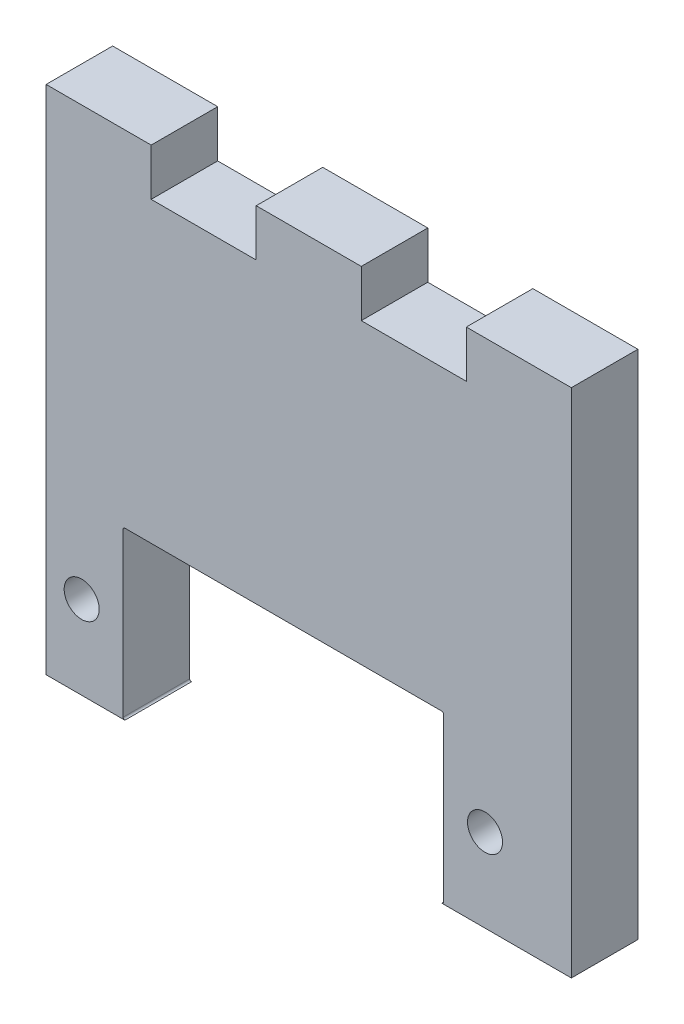
ISO-10303-21;
HEADER;
FILE_DESCRIPTION(('STEP AP214'),'2;1');
FILE_NAME('part.step','',(''),(''),'','','');
FILE_SCHEMA(('AUTOMOTIVE_DESIGN { 1 0 10303 214 1 1 1 1 }'));
ENDSEC;
DATA;
#1=APPLICATION_CONTEXT('core data for automotive mechanical design processes');
#2=APPLICATION_PROTOCOL_DEFINITION('international standard','automotive_design',2000,#1);
#3=PRODUCT_CONTEXT('',#1,'mechanical');
#4=PRODUCT('Part','Part','',(#3));
#5=PRODUCT_RELATED_PRODUCT_CATEGORY('part','',(#4));
#6=PRODUCT_DEFINITION_FORMATION('','',#4);
#7=PRODUCT_DEFINITION_CONTEXT('part definition',#1,'design');
#8=PRODUCT_DEFINITION('design','',#6,#7);
#9=PRODUCT_DEFINITION_SHAPE('','',#8);
#10=(LENGTH_UNIT() NAMED_UNIT(*) SI_UNIT(.MILLI.,.METRE.));
#11=(NAMED_UNIT(*) PLANE_ANGLE_UNIT() SI_UNIT($,.RADIAN.));
#12=(NAMED_UNIT(*) SI_UNIT($,.STERADIAN.) SOLID_ANGLE_UNIT());
#13=UNCERTAINTY_MEASURE_WITH_UNIT(LENGTH_MEASURE(1.E-05),#10,'distance_accuracy_value','');
#14=(GEOMETRIC_REPRESENTATION_CONTEXT(3) GLOBAL_UNCERTAINTY_ASSIGNED_CONTEXT((#13)) GLOBAL_UNIT_ASSIGNED_CONTEXT((#10,
#11,#12)) REPRESENTATION_CONTEXT('',''));
#15=CARTESIAN_POINT('',(0.,0.,0.));
#16=DIRECTION('',(0.,0.,1.));
#17=DIRECTION('',(1.,0.,0.));
#18=AXIS2_PLACEMENT_3D('',#15,#16,#17);
#19=CARTESIAN_POINT('',(0.,37.084,4.826));
#20=DIRECTION('',(0.,-1.,0.));
#21=DIRECTION('',(0.,0.,-1.));
#22=AXIS2_PLACEMENT_3D('',#19,#20,#21);
#23=PLANE('',#22);
#24=DIRECTION('',(-1.,0.,0.));
#25=VECTOR('',#24,1.);
#26=CARTESIAN_POINT('',(0.,37.084,4.826));
#27=LINE('',#26,#25);
#28=CARTESIAN_POINT('',(22.86,37.084,4.826));
#29=VERTEX_POINT('',#28);
#30=CARTESIAN_POINT('',(15.24,37.084,4.826));
#31=VERTEX_POINT('',#30);
#32=EDGE_CURVE('E316',#29,#31,#27,.T.);
#33=ORIENTED_EDGE('',*,*,#32,.F.);
#34=DIRECTION('',(0.,0.,1.));
#35=VECTOR('',#34,1.);
#36=CARTESIAN_POINT('',(22.86,37.084,0.));
#37=LINE('',#36,#35);
#38=CARTESIAN_POINT('',(22.86,37.084,0.));
#39=VERTEX_POINT('',#38);
#40=EDGE_CURVE('E199',#39,#29,#37,.T.);
#41=ORIENTED_EDGE('',*,*,#40,.F.);
#42=DIRECTION('',(-1.,0.,0.));
#43=VECTOR('',#42,1.);
#44=CARTESIAN_POINT('',(0.,37.084,0.));
#45=LINE('',#44,#43);
#46=CARTESIAN_POINT('',(15.24,37.084,0.));
#47=VERTEX_POINT('',#46);
#48=EDGE_CURVE('E190',#39,#47,#45,.T.);
#49=ORIENTED_EDGE('',*,*,#48,.T.);
#50=DIRECTION('',(0.,0.,1.));
#51=VECTOR('',#50,1.);
#52=CARTESIAN_POINT('',(15.24,37.084,0.));
#53=LINE('',#52,#51);
#54=EDGE_CURVE('E225',#47,#31,#53,.T.);
#55=ORIENTED_EDGE('',*,*,#54,.T.);
#56=EDGE_LOOP('',(#33,#41,#49,#55));
#57=FACE_BOUND('',#56,.T.);
#58=ADVANCED_FACE('F32',(#57),#23,.F.);
#59=CARTESIAN_POINT('',(7.61999999999999,37.084,4.826));
#60=VERTEX_POINT('',#59);
#61=CARTESIAN_POINT('',(0.,37.084,4.826));
#62=VERTEX_POINT('',#61);
#63=EDGE_CURVE('E311',#60,#62,#27,.T.);
#64=ORIENTED_EDGE('',*,*,#63,.F.);
#65=DIRECTION('',(0.,0.,1.));
#66=VECTOR('',#65,1.);
#67=CARTESIAN_POINT('',(7.61999999999999,37.084,0.));
#68=LINE('',#67,#66);
#69=CARTESIAN_POINT('',(7.61999999999999,37.084,0.));
#70=VERTEX_POINT('',#69);
#71=EDGE_CURVE('E222',#70,#60,#68,.T.);
#72=ORIENTED_EDGE('',*,*,#71,.F.);
#73=CARTESIAN_POINT('',(0.,37.084,0.));
#74=VERTEX_POINT('',#73);
#75=EDGE_CURVE('E325',#70,#74,#45,.T.);
#76=ORIENTED_EDGE('',*,*,#75,.T.);
#77=DIRECTION('',(0.,0.,-1.));
#78=VECTOR('',#77,1.);
#79=CARTESIAN_POINT('',(0.,37.084,4.826));
#80=LINE('',#79,#78);
#81=EDGE_CURVE('E315',#62,#74,#80,.T.);
#82=ORIENTED_EDGE('',*,*,#81,.F.);
#83=EDGE_LOOP('',(#64,#72,#76,#82));
#84=FACE_BOUND('',#83,.T.);
#85=ADVANCED_FACE('F399',(#84),#23,.F.);
#86=CARTESIAN_POINT('',(0.,0.,4.826));
#87=DIRECTION('',(0.,1.,0.));
#88=DIRECTION('',(0.,0.,1.));
#89=AXIS2_PLACEMENT_3D('',#86,#87,#88);
#90=PLANE('',#89);
#91=DIRECTION('',(0.,0.,-1.));
#92=VECTOR('',#91,1.);
#93=CARTESIAN_POINT('',(5.71500000000001,0.,4.826));
#94=LINE('',#93,#92);
#95=CARTESIAN_POINT('',(5.71500000000001,0.,4.826));
#96=VERTEX_POINT('',#95);
#97=CARTESIAN_POINT('',(5.71500000000001,0.,0.));
#98=VERTEX_POINT('',#97);
#99=EDGE_CURVE('E280',#96,#98,#94,.T.);
#100=ORIENTED_EDGE('',*,*,#99,.F.);
#101=DIRECTION('',(1.,0.,0.));
#102=VECTOR('',#101,1.);
#103=CARTESIAN_POINT('',(0.,0.,4.826));
#104=LINE('',#103,#102);
#105=CARTESIAN_POINT('',(0.,0.,4.826));
#106=VERTEX_POINT('',#105);
#107=EDGE_CURVE('E306',#106,#96,#104,.T.);
#108=ORIENTED_EDGE('',*,*,#107,.F.);
#109=DIRECTION('',(0.,0.,-1.));
#110=VECTOR('',#109,1.);
#111=CARTESIAN_POINT('',(0.,0.,4.826));
#112=LINE('',#111,#110);
#113=CARTESIAN_POINT('',(0.,0.,0.));
#114=VERTEX_POINT('',#113);
#115=EDGE_CURVE('E11',#106,#114,#112,.T.);
#116=ORIENTED_EDGE('',*,*,#115,.T.);
#117=DIRECTION('',(1.,0.,0.));
#118=VECTOR('',#117,1.);
#119=CARTESIAN_POINT('',(0.,0.,0.));
#120=LINE('',#119,#118);
#121=EDGE_CURVE('E320',#114,#98,#120,.T.);
#122=ORIENTED_EDGE('',*,*,#121,.T.);
#123=EDGE_LOOP('',(#100,#108,#116,#122));
#124=FACE_BOUND('',#123,.T.);
#125=ADVANCED_FACE('F381',(#124),#90,.F.);
#126=CARTESIAN_POINT('',(0.,0.,4.826));
#127=DIRECTION('',(1.,0.,0.));
#128=DIRECTION('',(0.,1.,0.));
#129=AXIS2_PLACEMENT_3D('',#126,#127,#128);
#130=PLANE('',#129);
#131=DIRECTION('',(0.,-1.,0.));
#132=VECTOR('',#131,1.);
#133=CARTESIAN_POINT('',(0.,0.,0.));
#134=LINE('',#133,#132);
#135=EDGE_CURVE('E298',#74,#114,#134,.T.);
#136=ORIENTED_EDGE('',*,*,#135,.T.);
#137=ORIENTED_EDGE('',*,*,#115,.F.);
#138=DIRECTION('',(0.,-1.,0.));
#139=VECTOR('',#138,1.);
#140=CARTESIAN_POINT('',(0.,0.,4.826));
#141=LINE('',#140,#139);
#142=EDGE_CURVE('E301',#62,#106,#141,.T.);
#143=ORIENTED_EDGE('',*,*,#142,.F.);
#144=ORIENTED_EDGE('',*,*,#81,.T.);
#145=EDGE_LOOP('',(#136,#137,#143,#144));
#146=FACE_BOUND('',#145,.T.);
#147=ADVANCED_FACE('F34',(#146),#130,.F.);
#148=CARTESIAN_POINT('',(28.702,0.,4.826));
#149=VERTEX_POINT('',#148);
#150=CARTESIAN_POINT('',(38.1,0.,4.826));
#151=VERTEX_POINT('',#150);
#152=EDGE_CURVE('E304',#149,#151,#104,.T.);
#153=ORIENTED_EDGE('',*,*,#152,.F.);
#154=DIRECTION('',(0.,0.,-1.));
#155=VECTOR('',#154,1.);
#156=CARTESIAN_POINT('',(28.702,0.,4.826));
#157=LINE('',#156,#155);
#158=CARTESIAN_POINT('',(28.702,0.,0.));
#159=VERTEX_POINT('',#158);
#160=EDGE_CURVE('E282',#149,#159,#157,.T.);
#161=ORIENTED_EDGE('',*,*,#160,.T.);
#162=CARTESIAN_POINT('',(38.1,0.,0.));
#163=VERTEX_POINT('',#162);
#164=EDGE_CURVE('E319',#159,#163,#120,.T.);
#165=ORIENTED_EDGE('',*,*,#164,.T.);
#166=DIRECTION('',(0.,0.,-1.));
#167=VECTOR('',#166,1.);
#168=CARTESIAN_POINT('',(38.1,0.,4.826));
#169=LINE('',#168,#167);
#170=EDGE_CURVE('E40',#151,#163,#169,.T.);
#171=ORIENTED_EDGE('',*,*,#170,.F.);
#172=EDGE_LOOP('',(#153,#161,#165,#171));
#173=FACE_BOUND('',#172,.T.);
#174=ADVANCED_FACE('F352',(#173),#90,.F.);
#175=CARTESIAN_POINT('',(38.1,0.,4.826));
#176=DIRECTION('',(-1.,0.,0.));
#177=DIRECTION('',(0.,-1.,0.));
#178=AXIS2_PLACEMENT_3D('',#175,#176,#177);
#179=PLANE('',#178);
#180=DIRECTION('',(0.,1.,0.));
#181=VECTOR('',#180,1.);
#182=CARTESIAN_POINT('',(38.1,0.,0.));
#183=LINE('',#182,#181);
#184=CARTESIAN_POINT('',(38.1,37.084,0.));
#185=VERTEX_POINT('',#184);
#186=EDGE_CURVE('E323',#163,#185,#183,.T.);
#187=ORIENTED_EDGE('',*,*,#186,.T.);
#188=DIRECTION('',(0.,0.,-1.));
#189=VECTOR('',#188,1.);
#190=CARTESIAN_POINT('',(38.1,37.084,4.826));
#191=LINE('',#190,#189);
#192=CARTESIAN_POINT('',(38.1,37.084,4.826));
#193=VERTEX_POINT('',#192);
#194=EDGE_CURVE('E330',#193,#185,#191,.T.);
#195=ORIENTED_EDGE('',*,*,#194,.F.);
#196=DIRECTION('',(0.,1.,0.));
#197=VECTOR('',#196,1.);
#198=CARTESIAN_POINT('',(38.1,0.,4.826));
#199=LINE('',#198,#197);
#200=EDGE_CURVE('E309',#151,#193,#199,.T.);
#201=ORIENTED_EDGE('',*,*,#200,.F.);
#202=ORIENTED_EDGE('',*,*,#170,.T.);
#203=EDGE_LOOP('',(#187,#195,#201,#202));
#204=FACE_BOUND('',#203,.T.);
#205=ADVANCED_FACE('F337',(#204),#179,.F.);
#206=CARTESIAN_POINT('',(30.48,37.084,0.));
#207=VERTEX_POINT('',#206);
#208=EDGE_CURVE('E305',#185,#207,#45,.T.);
#209=ORIENTED_EDGE('',*,*,#208,.T.);
#210=DIRECTION('',(0.,0.,1.));
#211=VECTOR('',#210,1.);
#212=CARTESIAN_POINT('',(30.48,37.084,0.));
#213=LINE('',#212,#211);
#214=CARTESIAN_POINT('',(30.48,37.084,4.826));
#215=VERTEX_POINT('',#214);
#216=EDGE_CURVE('E202',#207,#215,#213,.T.);
#217=ORIENTED_EDGE('',*,*,#216,.T.);
#218=EDGE_CURVE('E312',#193,#215,#27,.T.);
#219=ORIENTED_EDGE('',*,*,#218,.F.);
#220=ORIENTED_EDGE('',*,*,#194,.T.);
#221=EDGE_LOOP('',(#209,#217,#219,#220));
#222=FACE_BOUND('',#221,.T.);
#223=ADVANCED_FACE('F345',(#222),#23,.F.);
#224=CARTESIAN_POINT('',(0.,0.,4.826));
#225=DIRECTION('',(0.,0.,-1.));
#226=DIRECTION('',(-1.,0.,0.));
#227=AXIS2_PLACEMENT_3D('',#224,#225,#226);
#228=PLANE('',#227);
#229=DIRECTION('',(1.,0.,0.));
#230=VECTOR('',#229,1.);
#231=CARTESIAN_POINT('',(22.86,33.6740988287207,4.826));
#232=LINE('',#231,#230);
#233=CARTESIAN_POINT('',(22.86,33.6740988287207,4.826));
#234=VERTEX_POINT('',#233);
#235=CARTESIAN_POINT('',(30.48,33.6740988287207,4.826));
#236=VERTEX_POINT('',#235);
#237=EDGE_CURVE('E193',#234,#236,#232,.T.);
#238=ORIENTED_EDGE('',*,*,#237,.F.);
#239=DIRECTION('',(0.,-1.,0.));
#240=VECTOR('',#239,1.);
#241=CARTESIAN_POINT('',(22.86,37.084,4.826));
#242=LINE('',#241,#240);
#243=EDGE_CURVE('E176',#29,#234,#242,.T.);
#244=ORIENTED_EDGE('',*,*,#243,.F.);
#245=ORIENTED_EDGE('',*,*,#32,.T.);
#246=DIRECTION('',(0.,1.,0.));
#247=VECTOR('',#246,1.);
#248=CARTESIAN_POINT('',(15.24,37.084,4.826));
#249=LINE('',#248,#247);
#250=CARTESIAN_POINT('',(15.24,33.6740988287207,4.826));
#251=VERTEX_POINT('',#250);
#252=EDGE_CURVE('E210',#251,#31,#249,.T.);
#253=ORIENTED_EDGE('',*,*,#252,.F.);
#254=DIRECTION('',(1.,0.,0.));
#255=VECTOR('',#254,1.);
#256=CARTESIAN_POINT('',(7.61999999999999,33.6740988287207,4.826));
#257=LINE('',#256,#255);
#258=CARTESIAN_POINT('',(7.61999999999999,33.6740988287207,4.826));
#259=VERTEX_POINT('',#258);
#260=EDGE_CURVE('E217',#259,#251,#257,.T.);
#261=ORIENTED_EDGE('',*,*,#260,.F.);
#262=DIRECTION('',(0.,-1.,0.));
#263=VECTOR('',#262,1.);
#264=CARTESIAN_POINT('',(7.61999999999999,37.084,4.826));
#265=LINE('',#264,#263);
#266=EDGE_CURVE('E201',#60,#259,#265,.T.);
#267=ORIENTED_EDGE('',*,*,#266,.F.);
#268=ORIENTED_EDGE('',*,*,#63,.T.);
#269=ORIENTED_EDGE('',*,*,#142,.T.);
#270=ORIENTED_EDGE('',*,*,#107,.T.);
#271=CARTESIAN_POINT('',(5.71500000000001,0.126999999999999,4.826));
#272=DIRECTION('',(0.,0.,-1.));
#273=DIRECTION('',(-1.,0.,0.));
#274=AXIS2_PLACEMENT_3D('',#271,#272,#273);
#275=CIRCLE('',#274,0.127);
#276=CARTESIAN_POINT('',(5.58800000000001,0.126999999999999,4.826));
#277=VERTEX_POINT('',#276);
#278=EDGE_CURVE('E241',#96,#277,#275,.T.);
#279=ORIENTED_EDGE('',*,*,#278,.T.);
#280=DIRECTION('',(0.,1.,0.));
#281=VECTOR('',#280,1.);
#282=CARTESIAN_POINT('',(5.58800000000001,11.938,4.826));
#283=LINE('',#282,#281);
#284=CARTESIAN_POINT('',(5.58800000000001,11.938,4.826));
#285=VERTEX_POINT('',#284);
#286=EDGE_CURVE('E244',#277,#285,#283,.T.);
#287=ORIENTED_EDGE('',*,*,#286,.T.);
#288=CARTESIAN_POINT('',(5.71500000000001,11.938,4.826));
#289=DIRECTION('',(0.,0.,-1.));
#290=DIRECTION('',(-1.,0.,0.));
#291=AXIS2_PLACEMENT_3D('',#288,#289,#290);
#292=CIRCLE('',#291,0.127);
#293=CARTESIAN_POINT('',(5.71500000000001,12.065,4.826));
#294=VERTEX_POINT('',#293);
#295=EDGE_CURVE('E247',#285,#294,#292,.T.);
#296=ORIENTED_EDGE('',*,*,#295,.T.);
#297=DIRECTION('',(1.,0.,0.));
#298=VECTOR('',#297,1.);
#299=CARTESIAN_POINT('',(28.702,12.065,4.826));
#300=LINE('',#299,#298);
#301=CARTESIAN_POINT('',(28.702,12.065,4.826));
#302=VERTEX_POINT('',#301);
#303=EDGE_CURVE('E250',#294,#302,#300,.T.);
#304=ORIENTED_EDGE('',*,*,#303,.T.);
#305=CARTESIAN_POINT('',(28.702,11.938,4.826));
#306=DIRECTION('',(0.,0.,-1.));
#307=DIRECTION('',(-1.,0.,0.));
#308=AXIS2_PLACEMENT_3D('',#305,#306,#307);
#309=CIRCLE('',#308,0.127);
#310=CARTESIAN_POINT('',(28.829,11.938,4.826));
#311=VERTEX_POINT('',#310);
#312=EDGE_CURVE('E231',#302,#311,#309,.T.);
#313=ORIENTED_EDGE('',*,*,#312,.T.);
#314=DIRECTION('',(0.,-1.,0.));
#315=VECTOR('',#314,1.);
#316=CARTESIAN_POINT('',(28.829,0.126999999999995,4.826));
#317=LINE('',#316,#315);
#318=CARTESIAN_POINT('',(28.829,0.126999999999995,4.826));
#319=VERTEX_POINT('',#318);
#320=EDGE_CURVE('E234',#311,#319,#317,.T.);
#321=ORIENTED_EDGE('',*,*,#320,.T.);
#322=CARTESIAN_POINT('',(28.702,0.126999999999995,4.826));
#323=DIRECTION('',(0.,0.,-1.));
#324=DIRECTION('',(-1.,0.,0.));
#325=AXIS2_PLACEMENT_3D('',#322,#323,#324);
#326=CIRCLE('',#325,0.127);
#327=EDGE_CURVE('E238',#319,#149,#326,.T.);
#328=ORIENTED_EDGE('',*,*,#327,.T.);
#329=ORIENTED_EDGE('',*,*,#152,.T.);
#330=ORIENTED_EDGE('',*,*,#200,.T.);
#331=ORIENTED_EDGE('',*,*,#218,.T.);
#332=DIRECTION('',(0.,1.,0.));
#333=VECTOR('',#332,1.);
#334=CARTESIAN_POINT('',(30.48,37.084,4.826));
#335=LINE('',#334,#333);
#336=EDGE_CURVE('E191',#236,#215,#335,.T.);
#337=ORIENTED_EDGE('',*,*,#336,.F.);
#338=EDGE_LOOP('',(#238,#244,#245,#253,#261,#267,#268,#269,#270,#279,#287,#296,#304,#313,#321,
#328,#329,#330,#331,#337));
#339=FACE_BOUND('',#338,.T.);
#340=CARTESIAN_POINT('',(31.8365194618769,6.03249999999999,4.826));
#341=DIRECTION('',(0.,0.,1.));
#342=DIRECTION('',(1.,0.,0.));
#343=AXIS2_PLACEMENT_3D('',#340,#341,#342);
#344=CIRCLE('',#343,1.27);
#345=CARTESIAN_POINT('',(33.1065194618769,6.03249999999999,4.826));
#346=VERTEX_POINT('',#345);
#347=EDGE_CURVE('E273',#346,#346,#344,.T.);
#348=ORIENTED_EDGE('',*,*,#347,.F.);
#349=EDGE_LOOP('',(#348));
#350=FACE_BOUND('',#349,.T.);
#351=CARTESIAN_POINT('',(2.58048053812314,6.0325,4.826));
#352=DIRECTION('',(0.,0.,1.));
#353=DIRECTION('',(1.,0.,0.));
#354=AXIS2_PLACEMENT_3D('',#351,#352,#353);
#355=CIRCLE('',#354,1.27);
#356=CARTESIAN_POINT('',(3.85048053812314,6.0325,4.826));
#357=VERTEX_POINT('',#356);
#358=EDGE_CURVE('E292',#357,#357,#355,.T.);
#359=ORIENTED_EDGE('',*,*,#358,.F.);
#360=EDGE_LOOP('',(#359));
#361=FACE_BOUND('',#360,.T.);
#362=ADVANCED_FACE('F349',(#339,#350,#361),#228,.F.);
#363=CARTESIAN_POINT('',(0.,0.,0.));
#364=DIRECTION('',(0.,0.,-1.));
#365=DIRECTION('',(-1.,0.,0.));
#366=AXIS2_PLACEMENT_3D('',#363,#364,#365);
#367=PLANE('',#366);
#368=DIRECTION('',(0.,-1.,0.));
#369=VECTOR('',#368,1.);
#370=CARTESIAN_POINT('',(22.86,37.084,0.));
#371=LINE('',#370,#369);
#372=CARTESIAN_POINT('',(22.86,33.6740988287207,0.));
#373=VERTEX_POINT('',#372);
#374=EDGE_CURVE('E173',#39,#373,#371,.T.);
#375=ORIENTED_EDGE('',*,*,#374,.T.);
#376=DIRECTION('',(1.,0.,0.));
#377=VECTOR('',#376,1.);
#378=CARTESIAN_POINT('',(22.86,33.6740988287207,0.));
#379=LINE('',#378,#377);
#380=CARTESIAN_POINT('',(30.48,33.6740988287207,0.));
#381=VERTEX_POINT('',#380);
#382=EDGE_CURVE('E183',#373,#381,#379,.T.);
#383=ORIENTED_EDGE('',*,*,#382,.T.);
#384=DIRECTION('',(0.,1.,0.));
#385=VECTOR('',#384,1.);
#386=CARTESIAN_POINT('',(30.48,37.084,0.));
#387=LINE('',#386,#385);
#388=EDGE_CURVE('E47',#381,#207,#387,.T.);
#389=ORIENTED_EDGE('',*,*,#388,.T.);
#390=ORIENTED_EDGE('',*,*,#208,.F.);
#391=ORIENTED_EDGE('',*,*,#186,.F.);
#392=ORIENTED_EDGE('',*,*,#164,.F.);
#393=CARTESIAN_POINT('',(28.702,0.126999999999995,0.));
#394=DIRECTION('',(0.,0.,-1.));
#395=DIRECTION('',(-1.,0.,0.));
#396=AXIS2_PLACEMENT_3D('',#393,#394,#395);
#397=CIRCLE('',#396,0.127);
#398=CARTESIAN_POINT('',(28.829,0.126999999999995,0.));
#399=VERTEX_POINT('',#398);
#400=EDGE_CURVE('E258',#399,#159,#397,.T.);
#401=ORIENTED_EDGE('',*,*,#400,.F.);
#402=DIRECTION('',(0.,-1.,0.));
#403=VECTOR('',#402,1.);
#404=CARTESIAN_POINT('',(28.829,0.126999999999995,0.));
#405=LINE('',#404,#403);
#406=CARTESIAN_POINT('',(28.829,11.938,0.));
#407=VERTEX_POINT('',#406);
#408=EDGE_CURVE('E255',#407,#399,#405,.T.);
#409=ORIENTED_EDGE('',*,*,#408,.F.);
#410=CARTESIAN_POINT('',(28.702,11.938,0.));
#411=DIRECTION('',(0.,0.,-1.));
#412=DIRECTION('',(-1.,0.,0.));
#413=AXIS2_PLACEMENT_3D('',#410,#411,#412);
#414=CIRCLE('',#413,0.127);
#415=CARTESIAN_POINT('',(28.702,12.065,0.));
#416=VERTEX_POINT('',#415);
#417=EDGE_CURVE('E224',#416,#407,#414,.T.);
#418=ORIENTED_EDGE('',*,*,#417,.F.);
#419=DIRECTION('',(1.,0.,0.));
#420=VECTOR('',#419,1.);
#421=CARTESIAN_POINT('',(28.702,12.065,0.));
#422=LINE('',#421,#420);
#423=CARTESIAN_POINT('',(5.71500000000001,12.065,0.));
#424=VERTEX_POINT('',#423);
#425=EDGE_CURVE('E235',#424,#416,#422,.T.);
#426=ORIENTED_EDGE('',*,*,#425,.F.);
#427=CARTESIAN_POINT('',(5.71500000000001,11.938,0.));
#428=DIRECTION('',(0.,0.,-1.));
#429=DIRECTION('',(-1.,0.,0.));
#430=AXIS2_PLACEMENT_3D('',#427,#428,#429);
#431=CIRCLE('',#430,0.127);
#432=CARTESIAN_POINT('',(5.58800000000001,11.938,0.));
#433=VERTEX_POINT('',#432);
#434=EDGE_CURVE('E266',#433,#424,#431,.T.);
#435=ORIENTED_EDGE('',*,*,#434,.F.);
#436=DIRECTION('',(0.,1.,0.));
#437=VECTOR('',#436,1.);
#438=CARTESIAN_POINT('',(5.58800000000001,11.938,0.));
#439=LINE('',#438,#437);
#440=CARTESIAN_POINT('',(5.58800000000001,0.126999999999999,0.));
#441=VERTEX_POINT('',#440);
#442=EDGE_CURVE('E263',#441,#433,#439,.T.);
#443=ORIENTED_EDGE('',*,*,#442,.F.);
#444=CARTESIAN_POINT('',(5.71500000000001,0.126999999999999,0.));
#445=DIRECTION('',(0.,0.,-1.));
#446=DIRECTION('',(-1.,0.,0.));
#447=AXIS2_PLACEMENT_3D('',#444,#445,#446);
#448=CIRCLE('',#447,0.127);
#449=EDGE_CURVE('E260',#98,#441,#448,.T.);
#450=ORIENTED_EDGE('',*,*,#449,.F.);
#451=ORIENTED_EDGE('',*,*,#121,.F.);
#452=ORIENTED_EDGE('',*,*,#135,.F.);
#453=ORIENTED_EDGE('',*,*,#75,.F.);
#454=DIRECTION('',(0.,-1.,0.));
#455=VECTOR('',#454,1.);
#456=CARTESIAN_POINT('',(7.61999999999999,37.084,0.));
#457=LINE('',#456,#455);
#458=CARTESIAN_POINT('',(7.61999999999999,33.6740988287207,0.));
#459=VERTEX_POINT('',#458);
#460=EDGE_CURVE('E206',#70,#459,#457,.T.);
#461=ORIENTED_EDGE('',*,*,#460,.T.);
#462=DIRECTION('',(1.,0.,0.));
#463=VECTOR('',#462,1.);
#464=CARTESIAN_POINT('',(7.61999999999999,33.6740988287207,0.));
#465=LINE('',#464,#463);
#466=CARTESIAN_POINT('',(15.24,33.6740988287207,0.));
#467=VERTEX_POINT('',#466);
#468=EDGE_CURVE('E209',#459,#467,#465,.T.);
#469=ORIENTED_EDGE('',*,*,#468,.T.);
#470=DIRECTION('',(0.,1.,0.));
#471=VECTOR('',#470,1.);
#472=CARTESIAN_POINT('',(15.24,37.084,0.));
#473=LINE('',#472,#471);
#474=EDGE_CURVE('E55',#467,#47,#473,.T.);
#475=ORIENTED_EDGE('',*,*,#474,.T.);
#476=ORIENTED_EDGE('',*,*,#48,.F.);
#477=EDGE_LOOP('',(#375,#383,#389,#390,#391,#392,#401,#409,#418,#426,#435,#443,#450,#451,#452,
#453,#461,#469,#475,#476));
#478=FACE_BOUND('',#477,.T.);
#479=CARTESIAN_POINT('',(31.8365194618769,6.03249999999999,0.));
#480=DIRECTION('',(0.,0.,1.));
#481=DIRECTION('',(1.,0.,0.));
#482=AXIS2_PLACEMENT_3D('',#479,#480,#481);
#483=CIRCLE('',#482,1.27);
#484=CARTESIAN_POINT('',(33.1065194618769,6.03249999999999,0.));
#485=VERTEX_POINT('',#484);
#486=EDGE_CURVE('E289',#485,#485,#483,.T.);
#487=ORIENTED_EDGE('',*,*,#486,.T.);
#488=EDGE_LOOP('',(#487));
#489=FACE_BOUND('',#488,.T.);
#490=CARTESIAN_POINT('',(2.58048053812314,6.0325,0.));
#491=DIRECTION('',(0.,0.,1.));
#492=DIRECTION('',(1.,0.,0.));
#493=AXIS2_PLACEMENT_3D('',#490,#491,#492);
#494=CIRCLE('',#493,1.27);
#495=CARTESIAN_POINT('',(3.85048053812314,6.0325,0.));
#496=VERTEX_POINT('',#495);
#497=EDGE_CURVE('E295',#496,#496,#494,.T.);
#498=ORIENTED_EDGE('',*,*,#497,.T.);
#499=EDGE_LOOP('',(#498));
#500=FACE_BOUND('',#499,.T.);
#501=ADVANCED_FACE('F188',(#478,#489,#500),#367,.T.);
#502=CARTESIAN_POINT('',(2.58048053812314,6.0325,0.));
#503=DIRECTION('',(0.,0.,1.));
#504=DIRECTION('',(1.,0.,0.));
#505=AXIS2_PLACEMENT_3D('',#502,#503,#504);
#506=CYLINDRICAL_SURFACE('',#505,1.27);
#507=ORIENTED_EDGE('',*,*,#497,.F.);
#508=EDGE_LOOP('',(#507));
#509=FACE_BOUND('',#508,.T.);
#510=ORIENTED_EDGE('',*,*,#358,.T.);
#511=EDGE_LOOP('',(#510));
#512=FACE_BOUND('',#511,.T.);
#513=ADVANCED_FACE('F525',(#509,#512),#506,.F.);
#514=CARTESIAN_POINT('',(31.8365194618769,6.03249999999999,0.));
#515=DIRECTION('',(0.,0.,1.));
#516=DIRECTION('',(1.,0.,0.));
#517=AXIS2_PLACEMENT_3D('',#514,#515,#516);
#518=CYLINDRICAL_SURFACE('',#517,1.27);
#519=ORIENTED_EDGE('',*,*,#486,.F.);
#520=EDGE_LOOP('',(#519));
#521=FACE_BOUND('',#520,.T.);
#522=ORIENTED_EDGE('',*,*,#347,.T.);
#523=EDGE_LOOP('',(#522));
#524=FACE_BOUND('',#523,.T.);
#525=ADVANCED_FACE('F433',(#521,#524),#518,.F.);
#526=CARTESIAN_POINT('',(28.702,11.938,4.826));
#527=DIRECTION('',(0.,0.,-1.));
#528=DIRECTION('',(-1.,0.,0.));
#529=AXIS2_PLACEMENT_3D('',#526,#527,#528);
#530=CYLINDRICAL_SURFACE('',#529,0.127);
#531=ORIENTED_EDGE('',*,*,#417,.T.);
#532=DIRECTION('',(0.,0.,-1.));
#533=VECTOR('',#532,1.);
#534=CARTESIAN_POINT('',(28.829,11.938,4.826));
#535=LINE('',#534,#533);
#536=EDGE_CURVE('E253',#311,#407,#535,.T.);
#537=ORIENTED_EDGE('',*,*,#536,.F.);
#538=ORIENTED_EDGE('',*,*,#312,.F.);
#539=DIRECTION('',(0.,0.,-1.));
#540=VECTOR('',#539,1.);
#541=CARTESIAN_POINT('',(28.702,12.065,4.826));
#542=LINE('',#541,#540);
#543=EDGE_CURVE('E271',#302,#416,#542,.T.);
#544=ORIENTED_EDGE('',*,*,#543,.T.);
#545=EDGE_LOOP('',(#531,#537,#538,#544));
#546=FACE_BOUND('',#545,.T.);
#547=ADVANCED_FACE('F363',(#546),#530,.F.);
#548=CARTESIAN_POINT('',(28.702,12.065,4.826));
#549=DIRECTION('',(0.,1.,0.));
#550=DIRECTION('',(-1.,0.,0.));
#551=AXIS2_PLACEMENT_3D('',#548,#549,#550);
#552=PLANE('',#551);
#553=ORIENTED_EDGE('',*,*,#425,.T.);
#554=ORIENTED_EDGE('',*,*,#543,.F.);
#555=ORIENTED_EDGE('',*,*,#303,.F.);
#556=DIRECTION('',(0.,0.,-1.));
#557=VECTOR('',#556,1.);
#558=CARTESIAN_POINT('',(5.71500000000001,12.065,4.826));
#559=LINE('',#558,#557);
#560=EDGE_CURVE('E274',#294,#424,#559,.T.);
#561=ORIENTED_EDGE('',*,*,#560,.T.);
#562=EDGE_LOOP('',(#553,#554,#555,#561));
#563=FACE_BOUND('',#562,.T.);
#564=ADVANCED_FACE('F366',(#563),#552,.F.);
#565=CARTESIAN_POINT('',(5.71500000000001,11.938,4.826));
#566=DIRECTION('',(0.,0.,-1.));
#567=DIRECTION('',(-1.,0.,0.));
#568=AXIS2_PLACEMENT_3D('',#565,#566,#567);
#569=CYLINDRICAL_SURFACE('',#568,0.127);
#570=ORIENTED_EDGE('',*,*,#434,.T.);
#571=ORIENTED_EDGE('',*,*,#560,.F.);
#572=ORIENTED_EDGE('',*,*,#295,.F.);
#573=DIRECTION('',(0.,0.,-1.));
#574=VECTOR('',#573,1.);
#575=CARTESIAN_POINT('',(5.58800000000001,11.938,4.826));
#576=LINE('',#575,#574);
#577=EDGE_CURVE('E276',#285,#433,#576,.T.);
#578=ORIENTED_EDGE('',*,*,#577,.T.);
#579=EDGE_LOOP('',(#570,#571,#572,#578));
#580=FACE_BOUND('',#579,.T.);
#581=ADVANCED_FACE('F371',(#580),#569,.F.);
#582=CARTESIAN_POINT('',(5.58800000000001,11.938,4.826));
#583=DIRECTION('',(-1.,0.,0.));
#584=DIRECTION('',(0.,0.,1.));
#585=AXIS2_PLACEMENT_3D('',#582,#583,#584);
#586=PLANE('',#585);
#587=ORIENTED_EDGE('',*,*,#442,.T.);
#588=ORIENTED_EDGE('',*,*,#577,.F.);
#589=ORIENTED_EDGE('',*,*,#286,.F.);
#590=DIRECTION('',(0.,0.,-1.));
#591=VECTOR('',#590,1.);
#592=CARTESIAN_POINT('',(5.58800000000001,0.126999999999999,4.826));
#593=LINE('',#592,#591);
#594=EDGE_CURVE('E278',#277,#441,#593,.T.);
#595=ORIENTED_EDGE('',*,*,#594,.T.);
#596=EDGE_LOOP('',(#587,#588,#589,#595));
#597=FACE_BOUND('',#596,.T.);
#598=ADVANCED_FACE('F375',(#597),#586,.F.);
#599=CARTESIAN_POINT('',(5.71500000000001,0.126999999999999,4.826));
#600=DIRECTION('',(0.,0.,-1.));
#601=DIRECTION('',(-1.,0.,0.));
#602=AXIS2_PLACEMENT_3D('',#599,#600,#601);
#603=CYLINDRICAL_SURFACE('',#602,0.127);
#604=ORIENTED_EDGE('',*,*,#449,.T.);
#605=ORIENTED_EDGE('',*,*,#594,.F.);
#606=ORIENTED_EDGE('',*,*,#278,.F.);
#607=ORIENTED_EDGE('',*,*,#99,.T.);
#608=EDGE_LOOP('',(#604,#605,#606,#607));
#609=FACE_BOUND('',#608,.T.);
#610=ADVANCED_FACE('F377',(#609),#603,.F.);
#611=CARTESIAN_POINT('',(28.702,0.126999999999995,4.826));
#612=DIRECTION('',(0.,0.,-1.));
#613=DIRECTION('',(-1.,0.,0.));
#614=AXIS2_PLACEMENT_3D('',#611,#612,#613);
#615=CYLINDRICAL_SURFACE('',#614,0.127);
#616=ORIENTED_EDGE('',*,*,#400,.T.);
#617=ORIENTED_EDGE('',*,*,#160,.F.);
#618=ORIENTED_EDGE('',*,*,#327,.F.);
#619=DIRECTION('',(0.,0.,-1.));
#620=VECTOR('',#619,1.);
#621=CARTESIAN_POINT('',(28.829,0.126999999999995,4.826));
#622=LINE('',#621,#620);
#623=EDGE_CURVE('E285',#319,#399,#622,.T.);
#624=ORIENTED_EDGE('',*,*,#623,.T.);
#625=EDGE_LOOP('',(#616,#617,#618,#624));
#626=FACE_BOUND('',#625,.T.);
#627=ADVANCED_FACE('F354',(#626),#615,.F.);
#628=CARTESIAN_POINT('',(28.829,0.126999999999995,4.826));
#629=DIRECTION('',(1.,0.,0.));
#630=DIRECTION('',(0.,0.,-1.));
#631=AXIS2_PLACEMENT_3D('',#628,#629,#630);
#632=PLANE('',#631);
#633=ORIENTED_EDGE('',*,*,#408,.T.);
#634=ORIENTED_EDGE('',*,*,#623,.F.);
#635=ORIENTED_EDGE('',*,*,#320,.F.);
#636=ORIENTED_EDGE('',*,*,#536,.T.);
#637=EDGE_LOOP('',(#633,#634,#635,#636));
#638=FACE_BOUND('',#637,.T.);
#639=ADVANCED_FACE('F359',(#638),#632,.F.);
#640=CARTESIAN_POINT('',(7.61999999999999,37.084,0.));
#641=DIRECTION('',(-1.,0.,0.));
#642=DIRECTION('',(0.,0.,1.));
#643=AXIS2_PLACEMENT_3D('',#640,#641,#642);
#644=PLANE('',#643);
#645=ORIENTED_EDGE('',*,*,#266,.T.);
#646=DIRECTION('',(0.,0.,1.));
#647=VECTOR('',#646,1.);
#648=CARTESIAN_POINT('',(7.61999999999999,33.6740988287207,0.));
#649=LINE('',#648,#647);
#650=EDGE_CURVE('E214',#459,#259,#649,.T.);
#651=ORIENTED_EDGE('',*,*,#650,.F.);
#652=ORIENTED_EDGE('',*,*,#460,.F.);
#653=ORIENTED_EDGE('',*,*,#71,.T.);
#654=EDGE_LOOP('',(#645,#651,#652,#653));
#655=FACE_BOUND('',#654,.T.);
#656=ADVANCED_FACE('F494',(#655),#644,.F.);
#657=CARTESIAN_POINT('',(15.24,37.084,0.));
#658=DIRECTION('',(1.,0.,0.));
#659=DIRECTION('',(0.,0.,-1.));
#660=AXIS2_PLACEMENT_3D('',#657,#658,#659);
#661=PLANE('',#660);
#662=ORIENTED_EDGE('',*,*,#252,.T.);
#663=ORIENTED_EDGE('',*,*,#54,.F.);
#664=ORIENTED_EDGE('',*,*,#474,.F.);
#665=DIRECTION('',(0.,0.,1.));
#666=VECTOR('',#665,1.);
#667=CARTESIAN_POINT('',(15.24,33.6740988287207,0.));
#668=LINE('',#667,#666);
#669=EDGE_CURVE('E228',#467,#251,#668,.T.);
#670=ORIENTED_EDGE('',*,*,#669,.T.);
#671=EDGE_LOOP('',(#662,#663,#664,#670));
#672=FACE_BOUND('',#671,.T.);
#673=ADVANCED_FACE('F391',(#672),#661,.F.);
#674=CARTESIAN_POINT('',(7.61999999999999,33.6740988287207,0.));
#675=DIRECTION('',(0.,-1.,0.));
#676=DIRECTION('',(0.,0.,-1.));
#677=AXIS2_PLACEMENT_3D('',#674,#675,#676);
#678=PLANE('',#677);
#679=ORIENTED_EDGE('',*,*,#260,.T.);
#680=ORIENTED_EDGE('',*,*,#669,.F.);
#681=ORIENTED_EDGE('',*,*,#468,.F.);
#682=ORIENTED_EDGE('',*,*,#650,.T.);
#683=EDGE_LOOP('',(#679,#680,#681,#682));
#684=FACE_BOUND('',#683,.T.);
#685=ADVANCED_FACE('F395',(#684),#678,.F.);
#686=CARTESIAN_POINT('',(22.86,37.084,0.));
#687=DIRECTION('',(-1.,0.,0.));
#688=DIRECTION('',(0.,0.,1.));
#689=AXIS2_PLACEMENT_3D('',#686,#687,#688);
#690=PLANE('',#689);
#691=ORIENTED_EDGE('',*,*,#243,.T.);
#692=DIRECTION('',(0.,0.,1.));
#693=VECTOR('',#692,1.);
#694=CARTESIAN_POINT('',(22.86,33.6740988287207,0.));
#695=LINE('',#694,#693);
#696=EDGE_CURVE('E169',#373,#234,#695,.T.);
#697=ORIENTED_EDGE('',*,*,#696,.F.);
#698=ORIENTED_EDGE('',*,*,#374,.F.);
#699=ORIENTED_EDGE('',*,*,#40,.T.);
#700=EDGE_LOOP('',(#691,#697,#698,#699));
#701=FACE_BOUND('',#700,.T.);
#702=ADVANCED_FACE('F171',(#701),#690,.F.);
#703=CARTESIAN_POINT('',(30.48,37.084,0.));
#704=DIRECTION('',(1.,0.,0.));
#705=DIRECTION('',(0.,0.,-1.));
#706=AXIS2_PLACEMENT_3D('',#703,#704,#705);
#707=PLANE('',#706);
#708=ORIENTED_EDGE('',*,*,#336,.T.);
#709=ORIENTED_EDGE('',*,*,#216,.F.);
#710=ORIENTED_EDGE('',*,*,#388,.F.);
#711=DIRECTION('',(0.,0.,1.));
#712=VECTOR('',#711,1.);
#713=CARTESIAN_POINT('',(30.48,33.6740988287207,0.));
#714=LINE('',#713,#712);
#715=EDGE_CURVE('E180',#381,#236,#714,.T.);
#716=ORIENTED_EDGE('',*,*,#715,.T.);
#717=EDGE_LOOP('',(#708,#709,#710,#716));
#718=FACE_BOUND('',#717,.T.);
#719=ADVANCED_FACE('F558',(#718),#707,.F.);
#720=CARTESIAN_POINT('',(22.86,33.6740988287207,0.));
#721=DIRECTION('',(0.,-1.,0.));
#722=DIRECTION('',(0.,0.,-1.));
#723=AXIS2_PLACEMENT_3D('',#720,#721,#722);
#724=PLANE('',#723);
#725=ORIENTED_EDGE('',*,*,#237,.T.);
#726=ORIENTED_EDGE('',*,*,#715,.F.);
#727=ORIENTED_EDGE('',*,*,#382,.F.);
#728=ORIENTED_EDGE('',*,*,#696,.T.);
#729=EDGE_LOOP('',(#725,#726,#727,#728));
#730=FACE_BOUND('',#729,.T.);
#731=ADVANCED_FACE('F184',(#730),#724,.F.);
#732=CLOSED_SHELL('',(#58,#85,#125,#147,#174,#205,#223,#362,#501,#513,#525,#547,#564,#581,#598,
#610,#627,#639,#656,#673,#685,#702,#719,#731));
#733=MANIFOLD_SOLID_BREP('B2',#732);
#734=ADVANCED_BREP_SHAPE_REPRESENTATION('',(#18,#733),#14);
#735=SHAPE_DEFINITION_REPRESENTATION(#9,#734);
ENDSEC;
END-ISO-10303-21;
